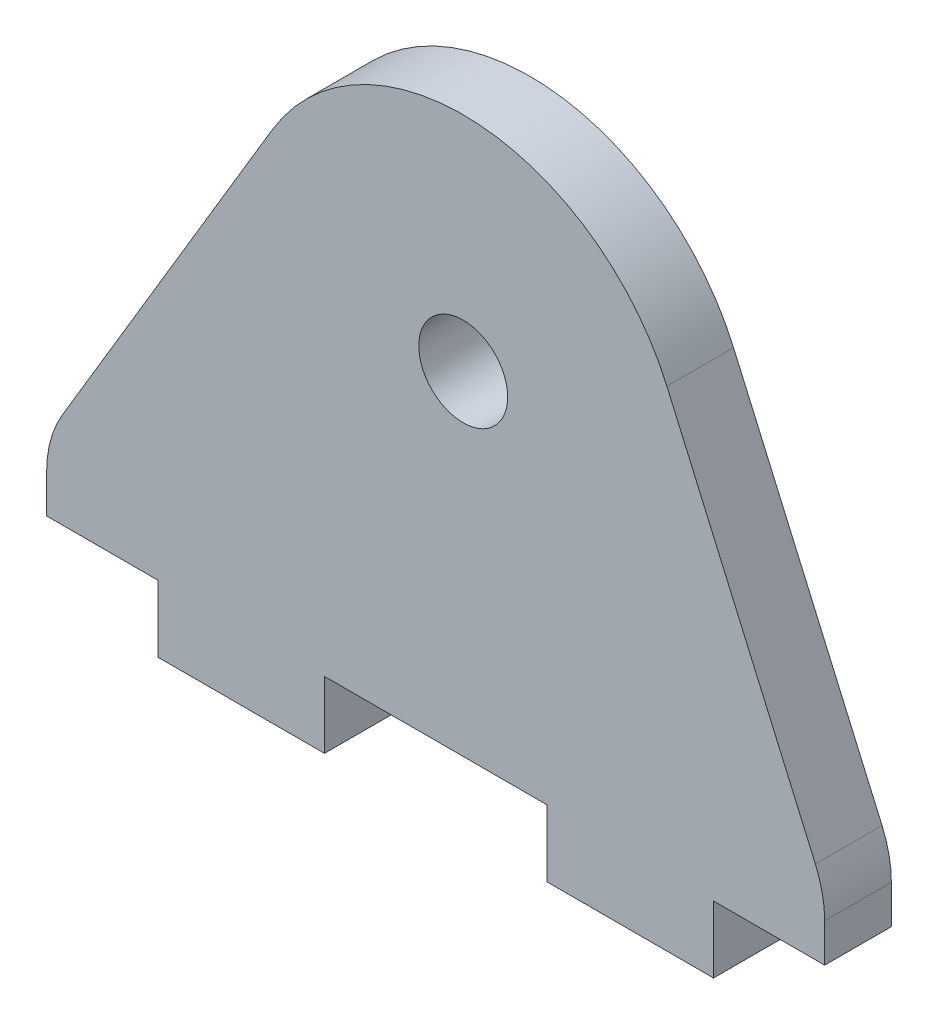
ISO-10303-21;
HEADER;
FILE_DESCRIPTION(('STEP AP214'),'2;1');
FILE_NAME('part.step','',(''),(''),'','','');
FILE_SCHEMA(('AUTOMOTIVE_DESIGN { 1 0 10303 214 1 1 1 1 }'));
ENDSEC;
DATA;
#1=APPLICATION_CONTEXT('core data for automotive mechanical design processes');
#2=APPLICATION_PROTOCOL_DEFINITION('international standard','automotive_design',2000,#1);
#3=PRODUCT_CONTEXT('',#1,'mechanical');
#4=PRODUCT('Part','Part','',(#3));
#5=PRODUCT_RELATED_PRODUCT_CATEGORY('part','',(#4));
#6=PRODUCT_DEFINITION_FORMATION('','',#4);
#7=PRODUCT_DEFINITION_CONTEXT('part definition',#1,'design');
#8=PRODUCT_DEFINITION('design','',#6,#7);
#9=PRODUCT_DEFINITION_SHAPE('','',#8);
#10=(LENGTH_UNIT() NAMED_UNIT(*) SI_UNIT(.MILLI.,.METRE.));
#11=(NAMED_UNIT(*) PLANE_ANGLE_UNIT() SI_UNIT($,.RADIAN.));
#12=(NAMED_UNIT(*) SI_UNIT($,.STERADIAN.) SOLID_ANGLE_UNIT());
#13=UNCERTAINTY_MEASURE_WITH_UNIT(LENGTH_MEASURE(1.E-05),#10,'distance_accuracy_value','');
#14=(GEOMETRIC_REPRESENTATION_CONTEXT(3) GLOBAL_UNCERTAINTY_ASSIGNED_CONTEXT((#13)) GLOBAL_UNIT_ASSIGNED_CONTEXT((#10,
#11,#12)) REPRESENTATION_CONTEXT('',''));
#15=CARTESIAN_POINT('',(0.,0.,0.));
#16=DIRECTION('',(0.,0.,1.));
#17=DIRECTION('',(1.,0.,0.));
#18=AXIS2_PLACEMENT_3D('',#15,#16,#17);
#19=CARTESIAN_POINT('',(36.5955388146516,12.048496629002,6.));
#20=DIRECTION('',(0.,0.,1.));
#21=DIRECTION('',(1.,0.,0.));
#22=AXIS2_PLACEMENT_3D('',#19,#20,#21);
#23=PLANE('',#22);
#24=DIRECTION('',(0.,-1.,0.));
#25=VECTOR('',#24,1.);
#26=CARTESIAN_POINT('',(-13.4044611853484,8.59377906838901,6.));
#27=LINE('',#26,#25);
#28=CARTESIAN_POINT('',(-13.4044611853484,8.59377906838901,6.));
#29=VERTEX_POINT('',#28);
#30=CARTESIAN_POINT('',(-13.4044611853484,2.59377906838901,6.));
#31=VERTEX_POINT('',#30);
#32=EDGE_CURVE('E209',#29,#31,#27,.T.);
#33=ORIENTED_EDGE('',*,*,#32,.T.);
#34=DIRECTION('',(1.,0.,0.));
#35=VECTOR('',#34,1.);
#36=CARTESIAN_POINT('',(-13.4044611853484,2.59377906838901,6.));
#37=LINE('',#36,#35);
#38=CARTESIAN_POINT('',(1.59553881465163,2.59377906838901,6.));
#39=VERTEX_POINT('',#38);
#40=EDGE_CURVE('E117',#31,#39,#37,.T.);
#41=ORIENTED_EDGE('',*,*,#40,.T.);
#42=DIRECTION('',(0.,1.,0.));
#43=VECTOR('',#42,1.);
#44=CARTESIAN_POINT('',(1.59553881465163,2.59377906838901,6.));
#45=LINE('',#44,#43);
#46=CARTESIAN_POINT('',(1.59553881465163,8.59377906838901,6.));
#47=VERTEX_POINT('',#46);
#48=EDGE_CURVE('E248',#39,#47,#45,.T.);
#49=ORIENTED_EDGE('',*,*,#48,.T.);
#50=DIRECTION('',(1.,0.,0.));
#51=VECTOR('',#50,1.);
#52=CARTESIAN_POINT('',(1.59553881465163,8.59377906838901,6.));
#53=LINE('',#52,#51);
#54=CARTESIAN_POINT('',(21.5955388146516,8.59377906838901,6.));
#55=VERTEX_POINT('',#54);
#56=EDGE_CURVE('E267',#47,#55,#53,.T.);
#57=ORIENTED_EDGE('',*,*,#56,.T.);
#58=DIRECTION('',(0.,-1.,0.));
#59=VECTOR('',#58,1.);
#60=CARTESIAN_POINT('',(21.5955388146516,8.59377906838901,6.));
#61=LINE('',#60,#59);
#62=CARTESIAN_POINT('',(21.5955388146516,2.59377906838901,6.));
#63=VERTEX_POINT('',#62);
#64=EDGE_CURVE('E264',#55,#63,#61,.T.);
#65=ORIENTED_EDGE('',*,*,#64,.T.);
#66=DIRECTION('',(1.,0.,0.));
#67=VECTOR('',#66,1.);
#68=CARTESIAN_POINT('',(21.5955388146516,2.59377906838901,6.));
#69=LINE('',#68,#67);
#70=CARTESIAN_POINT('',(36.5955388146516,2.59377906838901,6.));
#71=VERTEX_POINT('',#70);
#72=EDGE_CURVE('E266',#63,#71,#69,.T.);
#73=ORIENTED_EDGE('',*,*,#72,.T.);
#74=DIRECTION('',(0.,1.,0.));
#75=VECTOR('',#74,1.);
#76=CARTESIAN_POINT('',(36.5955388146516,2.59377906838901,6.));
#77=LINE('',#76,#75);
#78=CARTESIAN_POINT('',(36.5955388146516,8.59377906838901,6.));
#79=VERTEX_POINT('',#78);
#80=EDGE_CURVE('E269',#71,#79,#77,.T.);
#81=ORIENTED_EDGE('',*,*,#80,.T.);
#82=DIRECTION('',(1.,0.,0.));
#83=VECTOR('',#82,1.);
#84=CARTESIAN_POINT('',(36.5955388146516,8.59377906838901,6.));
#85=LINE('',#84,#83);
#86=CARTESIAN_POINT('',(46.5955388146516,8.59377906838901,6.));
#87=VERTEX_POINT('',#86);
#88=EDGE_CURVE('E275',#79,#87,#85,.T.);
#89=ORIENTED_EDGE('',*,*,#88,.T.);
#90=DIRECTION('',(0.,1.,0.));
#91=VECTOR('',#90,1.);
#92=CARTESIAN_POINT('',(46.5955388146516,8.59377906838901,6.));
#93=LINE('',#92,#91);
#94=CARTESIAN_POINT('',(46.5955388146516,12.048496629002,6.));
#95=VERTEX_POINT('',#94);
#96=EDGE_CURVE('E277',#87,#95,#93,.T.);
#97=ORIENTED_EDGE('',*,*,#96,.T.);
#98=CARTESIAN_POINT('',(36.5955388146516,12.048496629002,6.));
#99=DIRECTION('',(0.,0.,1.));
#100=DIRECTION('',(1.,0.,0.));
#101=AXIS2_PLACEMENT_3D('',#98,#99,#100);
#102=CIRCLE('',#101,10.);
#103=CARTESIAN_POINT('',(45.757845305206,16.0550087995995,6.));
#104=VERTEX_POINT('',#103);
#105=EDGE_CURVE('E279',#95,#104,#102,.T.);
#106=ORIENTED_EDGE('',*,*,#105,.T.);
#107=DIRECTION('',(-0.400651217059749,0.916230649055434,0.));
#108=VECTOR('',#107,1.);
#109=CARTESIAN_POINT('',(45.757845305206,16.0550087995995,6.));
#110=LINE('',#109,#108);
#111=CARTESIAN_POINT('',(32.3980939080344,46.606803409584,6.));
#112=VERTEX_POINT('',#111);
#113=EDGE_CURVE('E281',#104,#112,#110,.T.);
#114=ORIENTED_EDGE('',*,*,#113,.T.);
#115=CARTESIAN_POINT('',(14.0734809269257,38.593779068389,6.));
#116=DIRECTION('',(0.,0.,1.));
#117=DIRECTION('',(1.,0.,0.));
#118=AXIS2_PLACEMENT_3D('',#115,#116,#117);
#119=CIRCLE('',#118,20.);
#120=CARTESIAN_POINT('',(-3.10290349051306,48.8393546180771,6.));
#121=VERTEX_POINT('',#120);
#122=EDGE_CURVE('E283',#112,#121,#119,.T.);
#123=ORIENTED_EDGE('',*,*,#122,.T.);
#124=DIRECTION('',(-0.512278777484405,-0.858819220871938,0.));
#125=VECTOR('',#124,1.);
#126=CARTESIAN_POINT('',(-3.10290349051307,48.8393546180771,6.));
#127=LINE('',#126,#125);
#128=CARTESIAN_POINT('',(-21.9926533940678,17.171284403846,6.));
#129=VERTEX_POINT('',#128);
#130=EDGE_CURVE('E160',#121,#129,#127,.T.);
#131=ORIENTED_EDGE('',*,*,#130,.T.);
#132=CARTESIAN_POINT('',(-13.4044611853484,12.048496629002,6.));
#133=DIRECTION('',(0.,0.,1.));
#134=DIRECTION('',(1.,0.,0.));
#135=AXIS2_PLACEMENT_3D('',#132,#133,#134);
#136=CIRCLE('',#135,10.);
#137=CARTESIAN_POINT('',(-23.4044611853484,12.048496629002,6.));
#138=VERTEX_POINT('',#137);
#139=EDGE_CURVE('E154',#129,#138,#136,.T.);
#140=ORIENTED_EDGE('',*,*,#139,.T.);
#141=DIRECTION('',(0.,-1.,0.));
#142=VECTOR('',#141,1.);
#143=CARTESIAN_POINT('',(-23.4044611853484,12.048496629002,6.));
#144=LINE('',#143,#142);
#145=CARTESIAN_POINT('',(-23.4044611853484,8.59377906838901,6.));
#146=VERTEX_POINT('',#145);
#147=EDGE_CURVE('E158',#138,#146,#144,.T.);
#148=ORIENTED_EDGE('',*,*,#147,.T.);
#149=DIRECTION('',(1.,0.,0.));
#150=VECTOR('',#149,1.);
#151=CARTESIAN_POINT('',(-23.4044611853484,8.59377906838901,6.));
#152=LINE('',#151,#150);
#153=EDGE_CURVE('E50',#146,#29,#152,.T.);
#154=ORIENTED_EDGE('',*,*,#153,.T.);
#155=EDGE_LOOP('',(#33,#41,#49,#57,#65,#73,#81,#89,#97,#106,#114,#123,#131,#140,#148,#154));
#156=FACE_BOUND('',#155,.T.);
#157=CARTESIAN_POINT('',(14.0734809269257,38.593779068389,6.));
#158=DIRECTION('',(0.,0.,1.));
#159=DIRECTION('',(1.,0.,0.));
#160=AXIS2_PLACEMENT_3D('',#157,#158,#159);
#161=CIRCLE('',#160,4.00000000000001);
#162=CARTESIAN_POINT('',(18.0734809269257,38.593779068389,6.));
#163=VERTEX_POINT('',#162);
#164=EDGE_CURVE('E182',#163,#163,#161,.T.);
#165=ORIENTED_EDGE('',*,*,#164,.F.);
#166=EDGE_LOOP('',(#165));
#167=FACE_BOUND('',#166,.T.);
#168=ADVANCED_FACE('F33',(#156,#167),#23,.T.);
#169=CARTESIAN_POINT('',(36.5955388146516,12.048496629002,0.));
#170=DIRECTION('',(0.,0.,1.));
#171=DIRECTION('',(1.,0.,0.));
#172=AXIS2_PLACEMENT_3D('',#169,#170,#171);
#173=PLANE('',#172);
#174=DIRECTION('',(0.,-1.,0.));
#175=VECTOR('',#174,1.);
#176=CARTESIAN_POINT('',(-13.4044611853484,8.59377906838901,0.));
#177=LINE('',#176,#175);
#178=CARTESIAN_POINT('',(-13.4044611853484,8.59377906838901,0.));
#179=VERTEX_POINT('',#178);
#180=CARTESIAN_POINT('',(-13.4044611853484,2.59377906838901,0.));
#181=VERTEX_POINT('',#180);
#182=EDGE_CURVE('E178',#179,#181,#177,.T.);
#183=ORIENTED_EDGE('',*,*,#182,.F.);
#184=DIRECTION('',(1.,0.,0.));
#185=VECTOR('',#184,1.);
#186=CARTESIAN_POINT('',(-23.4044611853484,8.59377906838901,0.));
#187=LINE('',#186,#185);
#188=CARTESIAN_POINT('',(-23.4044611853484,8.59377906838901,0.));
#189=VERTEX_POINT('',#188);
#190=EDGE_CURVE('E109',#189,#179,#187,.T.);
#191=ORIENTED_EDGE('',*,*,#190,.F.);
#192=DIRECTION('',(0.,-1.,0.));
#193=VECTOR('',#192,1.);
#194=CARTESIAN_POINT('',(-23.4044611853484,12.048496629002,0.));
#195=LINE('',#194,#193);
#196=CARTESIAN_POINT('',(-23.4044611853484,12.048496629002,0.));
#197=VERTEX_POINT('',#196);
#198=EDGE_CURVE('E103',#197,#189,#195,.T.);
#199=ORIENTED_EDGE('',*,*,#198,.F.);
#200=CARTESIAN_POINT('',(-13.4044611853484,12.048496629002,0.));
#201=DIRECTION('',(0.,0.,1.));
#202=DIRECTION('',(1.,0.,0.));
#203=AXIS2_PLACEMENT_3D('',#200,#201,#202);
#204=CIRCLE('',#203,10.);
#205=CARTESIAN_POINT('',(-21.9926533940678,17.171284403846,0.));
#206=VERTEX_POINT('',#205);
#207=EDGE_CURVE('E168',#206,#197,#204,.T.);
#208=ORIENTED_EDGE('',*,*,#207,.F.);
#209=DIRECTION('',(-0.512278777484405,-0.858819220871938,0.));
#210=VECTOR('',#209,1.);
#211=CARTESIAN_POINT('',(-3.10290349051307,48.8393546180771,0.));
#212=LINE('',#211,#210);
#213=CARTESIAN_POINT('',(-3.10290349051306,48.8393546180771,0.));
#214=VERTEX_POINT('',#213);
#215=EDGE_CURVE('E204',#214,#206,#212,.T.);
#216=ORIENTED_EDGE('',*,*,#215,.F.);
#217=CARTESIAN_POINT('',(14.0734809269257,38.593779068389,0.));
#218=DIRECTION('',(0.,0.,1.));
#219=DIRECTION('',(1.,0.,0.));
#220=AXIS2_PLACEMENT_3D('',#217,#218,#219);
#221=CIRCLE('',#220,20.);
#222=CARTESIAN_POINT('',(32.3980939080344,46.606803409584,0.));
#223=VERTEX_POINT('',#222);
#224=EDGE_CURVE('E202',#223,#214,#221,.T.);
#225=ORIENTED_EDGE('',*,*,#224,.F.);
#226=DIRECTION('',(-0.400651217059749,0.916230649055434,0.));
#227=VECTOR('',#226,1.);
#228=CARTESIAN_POINT('',(45.757845305206,16.0550087995995,0.));
#229=LINE('',#228,#227);
#230=CARTESIAN_POINT('',(45.757845305206,16.0550087995995,0.));
#231=VERTEX_POINT('',#230);
#232=EDGE_CURVE('E200',#231,#223,#229,.T.);
#233=ORIENTED_EDGE('',*,*,#232,.F.);
#234=CARTESIAN_POINT('',(36.5955388146516,12.048496629002,0.));
#235=DIRECTION('',(0.,0.,1.));
#236=DIRECTION('',(1.,0.,0.));
#237=AXIS2_PLACEMENT_3D('',#234,#235,#236);
#238=CIRCLE('',#237,10.);
#239=CARTESIAN_POINT('',(46.5955388146516,12.048496629002,0.));
#240=VERTEX_POINT('',#239);
#241=EDGE_CURVE('E198',#240,#231,#238,.T.);
#242=ORIENTED_EDGE('',*,*,#241,.F.);
#243=DIRECTION('',(0.,1.,0.));
#244=VECTOR('',#243,1.);
#245=CARTESIAN_POINT('',(46.5955388146516,8.59377906838901,0.));
#246=LINE('',#245,#244);
#247=CARTESIAN_POINT('',(46.5955388146516,8.59377906838901,0.));
#248=VERTEX_POINT('',#247);
#249=EDGE_CURVE('E196',#248,#240,#246,.T.);
#250=ORIENTED_EDGE('',*,*,#249,.F.);
#251=DIRECTION('',(1.,0.,0.));
#252=VECTOR('',#251,1.);
#253=CARTESIAN_POINT('',(36.5955388146516,8.59377906838901,0.));
#254=LINE('',#253,#252);
#255=CARTESIAN_POINT('',(36.5955388146516,8.59377906838901,0.));
#256=VERTEX_POINT('',#255);
#257=EDGE_CURVE('E194',#256,#248,#254,.T.);
#258=ORIENTED_EDGE('',*,*,#257,.F.);
#259=DIRECTION('',(0.,1.,0.));
#260=VECTOR('',#259,1.);
#261=CARTESIAN_POINT('',(36.5955388146516,2.59377906838901,0.));
#262=LINE('',#261,#260);
#263=CARTESIAN_POINT('',(36.5955388146516,2.59377906838901,0.));
#264=VERTEX_POINT('',#263);
#265=EDGE_CURVE('E192',#264,#256,#262,.T.);
#266=ORIENTED_EDGE('',*,*,#265,.F.);
#267=DIRECTION('',(1.,0.,0.));
#268=VECTOR('',#267,1.);
#269=CARTESIAN_POINT('',(21.5955388146516,2.59377906838901,0.));
#270=LINE('',#269,#268);
#271=CARTESIAN_POINT('',(21.5955388146516,2.59377906838901,0.));
#272=VERTEX_POINT('',#271);
#273=EDGE_CURVE('E190',#272,#264,#270,.T.);
#274=ORIENTED_EDGE('',*,*,#273,.F.);
#275=DIRECTION('',(0.,-1.,0.));
#276=VECTOR('',#275,1.);
#277=CARTESIAN_POINT('',(21.5955388146516,8.59377906838901,0.));
#278=LINE('',#277,#276);
#279=CARTESIAN_POINT('',(21.5955388146516,8.59377906838901,0.));
#280=VERTEX_POINT('',#279);
#281=EDGE_CURVE('E188',#280,#272,#278,.T.);
#282=ORIENTED_EDGE('',*,*,#281,.F.);
#283=DIRECTION('',(1.,0.,0.));
#284=VECTOR('',#283,1.);
#285=CARTESIAN_POINT('',(1.59553881465163,8.59377906838901,0.));
#286=LINE('',#285,#284);
#287=CARTESIAN_POINT('',(1.59553881465163,8.59377906838901,0.));
#288=VERTEX_POINT('',#287);
#289=EDGE_CURVE('E186',#288,#280,#286,.T.);
#290=ORIENTED_EDGE('',*,*,#289,.F.);
#291=DIRECTION('',(0.,1.,0.));
#292=VECTOR('',#291,1.);
#293=CARTESIAN_POINT('',(1.59553881465163,2.59377906838901,0.));
#294=LINE('',#293,#292);
#295=CARTESIAN_POINT('',(1.59553881465163,2.59377906838901,0.));
#296=VERTEX_POINT('',#295);
#297=EDGE_CURVE('E184',#296,#288,#294,.T.);
#298=ORIENTED_EDGE('',*,*,#297,.F.);
#299=DIRECTION('',(1.,0.,0.));
#300=VECTOR('',#299,1.);
#301=CARTESIAN_POINT('',(-13.4044611853484,2.59377906838901,0.));
#302=LINE('',#301,#300);
#303=EDGE_CURVE('E181',#181,#296,#302,.T.);
#304=ORIENTED_EDGE('',*,*,#303,.F.);
#305=EDGE_LOOP('',(#183,#191,#199,#208,#216,#225,#233,#242,#250,#258,#266,#274,#282,#290,#298,#304));
#306=FACE_BOUND('',#305,.T.);
#307=CARTESIAN_POINT('',(14.0734809269257,38.593779068389,0.));
#308=DIRECTION('',(0.,0.,1.));
#309=DIRECTION('',(1.,0.,0.));
#310=AXIS2_PLACEMENT_3D('',#307,#308,#309);
#311=CIRCLE('',#310,4.00000000000001);
#312=CARTESIAN_POINT('',(18.0734809269257,38.593779068389,0.));
#313=VERTEX_POINT('',#312);
#314=EDGE_CURVE('E482',#313,#313,#311,.T.);
#315=ORIENTED_EDGE('',*,*,#314,.T.);
#316=EDGE_LOOP('',(#315));
#317=FACE_BOUND('',#316,.T.);
#318=ADVANCED_FACE('F252',(#306,#317),#173,.F.);
#319=CARTESIAN_POINT('',(-13.4044611853484,8.59377906838901,6.));
#320=DIRECTION('',(1.,0.,0.));
#321=DIRECTION('',(0.,1.,0.));
#322=AXIS2_PLACEMENT_3D('',#319,#320,#321);
#323=PLANE('',#322);
#324=ORIENTED_EDGE('',*,*,#182,.T.);
#325=DIRECTION('',(0.,0.,-1.));
#326=VECTOR('',#325,1.);
#327=CARTESIAN_POINT('',(-13.4044611853484,2.59377906838901,6.));
#328=LINE('',#327,#326);
#329=EDGE_CURVE('E11',#31,#181,#328,.T.);
#330=ORIENTED_EDGE('',*,*,#329,.F.);
#331=ORIENTED_EDGE('',*,*,#32,.F.);
#332=DIRECTION('',(0.,0.,-1.));
#333=VECTOR('',#332,1.);
#334=CARTESIAN_POINT('',(-13.4044611853484,8.59377906838901,6.));
#335=LINE('',#334,#333);
#336=EDGE_CURVE('E174',#29,#179,#335,.T.);
#337=ORIENTED_EDGE('',*,*,#336,.T.);
#338=EDGE_LOOP('',(#324,#330,#331,#337));
#339=FACE_BOUND('',#338,.T.);
#340=ADVANCED_FACE('F35',(#339),#323,.F.);
#341=CARTESIAN_POINT('',(-13.4044611853484,2.59377906838901,6.));
#342=DIRECTION('',(0.,1.,0.));
#343=DIRECTION('',(0.,0.,1.));
#344=AXIS2_PLACEMENT_3D('',#341,#342,#343);
#345=PLANE('',#344);
#346=ORIENTED_EDGE('',*,*,#303,.T.);
#347=DIRECTION('',(0.,0.,-1.));
#348=VECTOR('',#347,1.);
#349=CARTESIAN_POINT('',(1.59553881465163,2.59377906838901,6.));
#350=LINE('',#349,#348);
#351=EDGE_CURVE('E42',#39,#296,#350,.T.);
#352=ORIENTED_EDGE('',*,*,#351,.F.);
#353=ORIENTED_EDGE('',*,*,#40,.F.);
#354=ORIENTED_EDGE('',*,*,#329,.T.);
#355=EDGE_LOOP('',(#346,#352,#353,#354));
#356=FACE_BOUND('',#355,.T.);
#357=ADVANCED_FACE('F317',(#356),#345,.F.);
#358=CARTESIAN_POINT('',(1.59553881465163,2.59377906838901,6.));
#359=DIRECTION('',(-1.,0.,0.));
#360=DIRECTION('',(0.,0.,1.));
#361=AXIS2_PLACEMENT_3D('',#358,#359,#360);
#362=PLANE('',#361);
#363=ORIENTED_EDGE('',*,*,#297,.T.);
#364=DIRECTION('',(0.,0.,-1.));
#365=VECTOR('',#364,1.);
#366=CARTESIAN_POINT('',(1.59553881465163,8.59377906838901,6.));
#367=LINE('',#366,#365);
#368=EDGE_CURVE('E240',#47,#288,#367,.T.);
#369=ORIENTED_EDGE('',*,*,#368,.F.);
#370=ORIENTED_EDGE('',*,*,#48,.F.);
#371=ORIENTED_EDGE('',*,*,#351,.T.);
#372=EDGE_LOOP('',(#363,#369,#370,#371));
#373=FACE_BOUND('',#372,.T.);
#374=ADVANCED_FACE('F246',(#373),#362,.F.);
#375=CARTESIAN_POINT('',(1.59553881465163,8.59377906838901,6.));
#376=DIRECTION('',(0.,1.,0.));
#377=DIRECTION('',(0.,0.,1.));
#378=AXIS2_PLACEMENT_3D('',#375,#376,#377);
#379=PLANE('',#378);
#380=ORIENTED_EDGE('',*,*,#289,.T.);
#381=DIRECTION('',(0.,0.,-1.));
#382=VECTOR('',#381,1.);
#383=CARTESIAN_POINT('',(21.5955388146516,8.59377906838901,6.));
#384=LINE('',#383,#382);
#385=EDGE_CURVE('E237',#55,#280,#384,.T.);
#386=ORIENTED_EDGE('',*,*,#385,.F.);
#387=ORIENTED_EDGE('',*,*,#56,.F.);
#388=ORIENTED_EDGE('',*,*,#368,.T.);
#389=EDGE_LOOP('',(#380,#386,#387,#388));
#390=FACE_BOUND('',#389,.T.);
#391=ADVANCED_FACE('F258',(#390),#379,.F.);
#392=CARTESIAN_POINT('',(21.5955388146516,8.59377906838901,6.));
#393=DIRECTION('',(1.,0.,0.));
#394=DIRECTION('',(0.,0.,-1.));
#395=AXIS2_PLACEMENT_3D('',#392,#393,#394);
#396=PLANE('',#395);
#397=ORIENTED_EDGE('',*,*,#281,.T.);
#398=DIRECTION('',(0.,0.,-1.));
#399=VECTOR('',#398,1.);
#400=CARTESIAN_POINT('',(21.5955388146516,2.59377906838901,6.));
#401=LINE('',#400,#399);
#402=EDGE_CURVE('E234',#63,#272,#401,.T.);
#403=ORIENTED_EDGE('',*,*,#402,.F.);
#404=ORIENTED_EDGE('',*,*,#64,.F.);
#405=ORIENTED_EDGE('',*,*,#385,.T.);
#406=EDGE_LOOP('',(#397,#403,#404,#405));
#407=FACE_BOUND('',#406,.T.);
#408=ADVANCED_FACE('F262',(#407),#396,.F.);
#409=CARTESIAN_POINT('',(21.5955388146516,2.59377906838901,6.));
#410=DIRECTION('',(0.,1.,0.));
#411=DIRECTION('',(0.,0.,1.));
#412=AXIS2_PLACEMENT_3D('',#409,#410,#411);
#413=PLANE('',#412);
#414=ORIENTED_EDGE('',*,*,#273,.T.);
#415=DIRECTION('',(0.,0.,-1.));
#416=VECTOR('',#415,1.);
#417=CARTESIAN_POINT('',(36.5955388146516,2.59377906838901,6.));
#418=LINE('',#417,#416);
#419=EDGE_CURVE('E231',#71,#264,#418,.T.);
#420=ORIENTED_EDGE('',*,*,#419,.F.);
#421=ORIENTED_EDGE('',*,*,#72,.F.);
#422=ORIENTED_EDGE('',*,*,#402,.T.);
#423=EDGE_LOOP('',(#414,#420,#421,#422));
#424=FACE_BOUND('',#423,.T.);
#425=ADVANCED_FACE('F330',(#424),#413,.F.);
#426=CARTESIAN_POINT('',(36.5955388146516,2.59377906838901,6.));
#427=DIRECTION('',(-1.,0.,0.));
#428=DIRECTION('',(0.,0.,1.));
#429=AXIS2_PLACEMENT_3D('',#426,#427,#428);
#430=PLANE('',#429);
#431=ORIENTED_EDGE('',*,*,#265,.T.);
#432=DIRECTION('',(0.,0.,-1.));
#433=VECTOR('',#432,1.);
#434=CARTESIAN_POINT('',(36.5955388146516,8.59377906838901,6.));
#435=LINE('',#434,#433);
#436=EDGE_CURVE('E228',#79,#256,#435,.T.);
#437=ORIENTED_EDGE('',*,*,#436,.F.);
#438=ORIENTED_EDGE('',*,*,#80,.F.);
#439=ORIENTED_EDGE('',*,*,#419,.T.);
#440=EDGE_LOOP('',(#431,#437,#438,#439));
#441=FACE_BOUND('',#440,.T.);
#442=ADVANCED_FACE('F333',(#441),#430,.F.);
#443=CARTESIAN_POINT('',(36.5955388146516,8.59377906838901,6.));
#444=DIRECTION('',(0.,1.,0.));
#445=DIRECTION('',(0.,0.,1.));
#446=AXIS2_PLACEMENT_3D('',#443,#444,#445);
#447=PLANE('',#446);
#448=ORIENTED_EDGE('',*,*,#257,.T.);
#449=DIRECTION('',(0.,0.,-1.));
#450=VECTOR('',#449,1.);
#451=CARTESIAN_POINT('',(46.5955388146516,8.59377906838901,6.));
#452=LINE('',#451,#450);
#453=EDGE_CURVE('E225',#87,#248,#452,.T.);
#454=ORIENTED_EDGE('',*,*,#453,.F.);
#455=ORIENTED_EDGE('',*,*,#88,.F.);
#456=ORIENTED_EDGE('',*,*,#436,.T.);
#457=EDGE_LOOP('',(#448,#454,#455,#456));
#458=FACE_BOUND('',#457,.T.);
#459=ADVANCED_FACE('F337',(#458),#447,.F.);
#460=CARTESIAN_POINT('',(46.5955388146516,8.59377906838901,6.));
#461=DIRECTION('',(-1.,0.,0.));
#462=DIRECTION('',(0.,-1.,0.));
#463=AXIS2_PLACEMENT_3D('',#460,#461,#462);
#464=PLANE('',#463);
#465=ORIENTED_EDGE('',*,*,#249,.T.);
#466=DIRECTION('',(0.,0.,-1.));
#467=VECTOR('',#466,1.);
#468=CARTESIAN_POINT('',(46.5955388146516,12.048496629002,6.));
#469=LINE('',#468,#467);
#470=EDGE_CURVE('E222',#95,#240,#469,.T.);
#471=ORIENTED_EDGE('',*,*,#470,.F.);
#472=ORIENTED_EDGE('',*,*,#96,.F.);
#473=ORIENTED_EDGE('',*,*,#453,.T.);
#474=EDGE_LOOP('',(#465,#471,#472,#473));
#475=FACE_BOUND('',#474,.T.);
#476=ADVANCED_FACE('F341',(#475),#464,.F.);
#477=CARTESIAN_POINT('',(36.5955388146516,12.048496629002,6.));
#478=DIRECTION('',(0.,0.,-1.));
#479=DIRECTION('',(-1.,0.,0.));
#480=AXIS2_PLACEMENT_3D('',#477,#478,#479);
#481=CYLINDRICAL_SURFACE('',#480,10.);
#482=ORIENTED_EDGE('',*,*,#241,.T.);
#483=DIRECTION('',(0.,0.,-1.));
#484=VECTOR('',#483,1.);
#485=CARTESIAN_POINT('',(45.757845305206,16.0550087995995,6.));
#486=LINE('',#485,#484);
#487=EDGE_CURVE('E219',#104,#231,#486,.T.);
#488=ORIENTED_EDGE('',*,*,#487,.F.);
#489=ORIENTED_EDGE('',*,*,#105,.F.);
#490=ORIENTED_EDGE('',*,*,#470,.T.);
#491=EDGE_LOOP('',(#482,#488,#489,#490));
#492=FACE_BOUND('',#491,.T.);
#493=ADVANCED_FACE('F345',(#492),#481,.T.);
#494=CARTESIAN_POINT('',(45.757845305206,16.0550087995995,6.));
#495=DIRECTION('',(-0.916230649055434,-0.400651217059749,0.));
#496=DIRECTION('',(0.400651217059749,-0.916230649055434,0.));
#497=AXIS2_PLACEMENT_3D('',#494,#495,#496);
#498=PLANE('',#497);
#499=ORIENTED_EDGE('',*,*,#232,.T.);
#500=DIRECTION('',(0.,0.,-1.));
#501=VECTOR('',#500,1.);
#502=CARTESIAN_POINT('',(32.3980939080344,46.606803409584,6.));
#503=LINE('',#502,#501);
#504=EDGE_CURVE('E216',#112,#223,#503,.T.);
#505=ORIENTED_EDGE('',*,*,#504,.F.);
#506=ORIENTED_EDGE('',*,*,#113,.F.);
#507=ORIENTED_EDGE('',*,*,#487,.T.);
#508=EDGE_LOOP('',(#499,#505,#506,#507));
#509=FACE_BOUND('',#508,.T.);
#510=ADVANCED_FACE('F349',(#509),#498,.F.);
#511=CARTESIAN_POINT('',(14.0734809269257,38.593779068389,6.));
#512=DIRECTION('',(0.,0.,-1.));
#513=DIRECTION('',(-1.,0.,0.));
#514=AXIS2_PLACEMENT_3D('',#511,#512,#513);
#515=CYLINDRICAL_SURFACE('',#514,20.);
#516=ORIENTED_EDGE('',*,*,#224,.T.);
#517=DIRECTION('',(0.,0.,-1.));
#518=VECTOR('',#517,1.);
#519=CARTESIAN_POINT('',(-3.10290349051306,48.8393546180771,6.));
#520=LINE('',#519,#518);
#521=EDGE_CURVE('E213',#121,#214,#520,.T.);
#522=ORIENTED_EDGE('',*,*,#521,.F.);
#523=ORIENTED_EDGE('',*,*,#122,.F.);
#524=ORIENTED_EDGE('',*,*,#504,.T.);
#525=EDGE_LOOP('',(#516,#522,#523,#524));
#526=FACE_BOUND('',#525,.T.);
#527=ADVANCED_FACE('F289',(#526),#515,.T.);
#528=CARTESIAN_POINT('',(-3.10290349051307,48.8393546180771,6.));
#529=DIRECTION('',(0.858819220871938,-0.512278777484405,0.));
#530=DIRECTION('',(0.512278777484405,0.858819220871938,0.));
#531=AXIS2_PLACEMENT_3D('',#528,#529,#530);
#532=PLANE('',#531);
#533=ORIENTED_EDGE('',*,*,#215,.T.);
#534=DIRECTION('',(0.,0.,-1.));
#535=VECTOR('',#534,1.);
#536=CARTESIAN_POINT('',(-21.9926533940678,17.171284403846,6.));
#537=LINE('',#536,#535);
#538=EDGE_CURVE('E169',#129,#206,#537,.T.);
#539=ORIENTED_EDGE('',*,*,#538,.F.);
#540=ORIENTED_EDGE('',*,*,#130,.F.);
#541=ORIENTED_EDGE('',*,*,#521,.T.);
#542=EDGE_LOOP('',(#533,#539,#540,#541));
#543=FACE_BOUND('',#542,.T.);
#544=ADVANCED_FACE('F293',(#543),#532,.F.);
#545=CARTESIAN_POINT('',(-13.4044611853484,12.048496629002,6.));
#546=DIRECTION('',(0.,0.,-1.));
#547=DIRECTION('',(-1.,0.,0.));
#548=AXIS2_PLACEMENT_3D('',#545,#546,#547);
#549=CYLINDRICAL_SURFACE('',#548,10.);
#550=ORIENTED_EDGE('',*,*,#207,.T.);
#551=DIRECTION('',(0.,0.,-1.));
#552=VECTOR('',#551,1.);
#553=CARTESIAN_POINT('',(-23.4044611853484,12.048496629002,6.));
#554=LINE('',#553,#552);
#555=EDGE_CURVE('E165',#138,#197,#554,.T.);
#556=ORIENTED_EDGE('',*,*,#555,.F.);
#557=ORIENTED_EDGE('',*,*,#139,.F.);
#558=ORIENTED_EDGE('',*,*,#538,.T.);
#559=EDGE_LOOP('',(#550,#556,#557,#558));
#560=FACE_BOUND('',#559,.T.);
#561=ADVANCED_FACE('F166',(#560),#549,.T.);
#562=CARTESIAN_POINT('',(-23.4044611853484,12.048496629002,6.));
#563=DIRECTION('',(1.,0.,0.));
#564=DIRECTION('',(0.,0.,-1.));
#565=AXIS2_PLACEMENT_3D('',#562,#563,#564);
#566=PLANE('',#565);
#567=ORIENTED_EDGE('',*,*,#198,.T.);
#568=DIRECTION('',(0.,0.,-1.));
#569=VECTOR('',#568,1.);
#570=CARTESIAN_POINT('',(-23.4044611853484,8.59377906838901,6.));
#571=LINE('',#570,#569);
#572=EDGE_CURVE('E170',#146,#189,#571,.T.);
#573=ORIENTED_EDGE('',*,*,#572,.F.);
#574=ORIENTED_EDGE('',*,*,#147,.F.);
#575=ORIENTED_EDGE('',*,*,#555,.T.);
#576=EDGE_LOOP('',(#567,#573,#574,#575));
#577=FACE_BOUND('',#576,.T.);
#578=ADVANCED_FACE('F172',(#577),#566,.F.);
#579=CARTESIAN_POINT('',(-23.4044611853484,8.59377906838901,6.));
#580=DIRECTION('',(0.,1.,0.));
#581=DIRECTION('',(0.,0.,1.));
#582=AXIS2_PLACEMENT_3D('',#579,#580,#581);
#583=PLANE('',#582);
#584=ORIENTED_EDGE('',*,*,#190,.T.);
#585=ORIENTED_EDGE('',*,*,#336,.F.);
#586=ORIENTED_EDGE('',*,*,#153,.F.);
#587=ORIENTED_EDGE('',*,*,#572,.T.);
#588=EDGE_LOOP('',(#584,#585,#586,#587));
#589=FACE_BOUND('',#588,.T.);
#590=ADVANCED_FACE('F297',(#589),#583,.F.);
#591=CARTESIAN_POINT('',(14.0734809269257,38.593779068389,6.));
#592=DIRECTION('',(0.,0.,-1.));
#593=DIRECTION('',(-1.,0.,0.));
#594=AXIS2_PLACEMENT_3D('',#591,#592,#593);
#595=CYLINDRICAL_SURFACE('',#594,4.00000000000001);
#596=ORIENTED_EDGE('',*,*,#164,.T.);
#597=EDGE_LOOP('',(#596));
#598=FACE_BOUND('',#597,.T.);
#599=ORIENTED_EDGE('',*,*,#314,.F.);
#600=EDGE_LOOP('',(#599));
#601=FACE_BOUND('',#600,.T.);
#602=ADVANCED_FACE('F299',(#598,#601),#595,.F.);
#603=CLOSED_SHELL('',(#168,#318,#340,#357,#374,#391,#408,#425,#442,#459,#476,#493,#510,#527,
#544,#561,#578,#590,#602));
#604=MANIFOLD_SOLID_BREP('B2',#603);
#605=ADVANCED_BREP_SHAPE_REPRESENTATION('',(#18,#604),#14);
#606=SHAPE_DEFINITION_REPRESENTATION(#9,#605);
ENDSEC;
END-ISO-10303-21;
